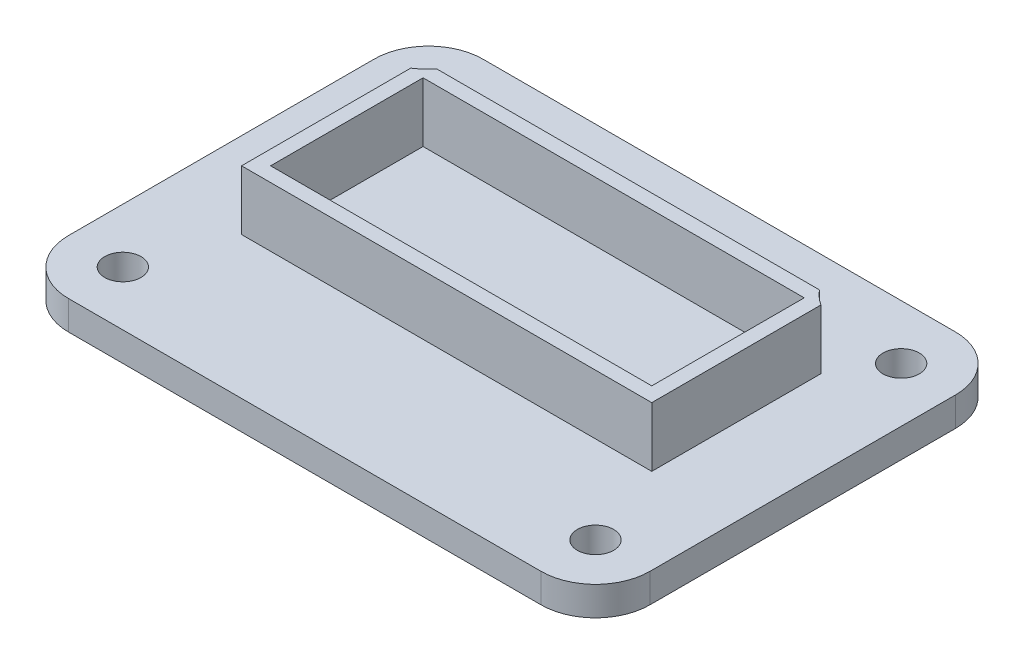
ISO-10303-21;
HEADER;
FILE_DESCRIPTION(('STEP AP214'),'2;1');
FILE_NAME('part.step','',(''),(''),'','','');
FILE_SCHEMA(('AUTOMOTIVE_DESIGN { 1 0 10303 214 1 1 1 1 }'));
ENDSEC;
DATA;
#1=APPLICATION_CONTEXT('core data for automotive mechanical design processes');
#2=APPLICATION_PROTOCOL_DEFINITION('international standard','automotive_design',2000,#1);
#3=PRODUCT_CONTEXT('',#1,'mechanical');
#4=PRODUCT('Part','Part','',(#3));
#5=PRODUCT_RELATED_PRODUCT_CATEGORY('part','',(#4));
#6=PRODUCT_DEFINITION_FORMATION('','',#4);
#7=PRODUCT_DEFINITION_CONTEXT('part definition',#1,'design');
#8=PRODUCT_DEFINITION('design','',#6,#7);
#9=PRODUCT_DEFINITION_SHAPE('','',#8);
#10=(LENGTH_UNIT() NAMED_UNIT(*) SI_UNIT(.MILLI.,.METRE.));
#11=(NAMED_UNIT(*) PLANE_ANGLE_UNIT() SI_UNIT($,.RADIAN.));
#12=(NAMED_UNIT(*) SI_UNIT($,.STERADIAN.) SOLID_ANGLE_UNIT());
#13=UNCERTAINTY_MEASURE_WITH_UNIT(LENGTH_MEASURE(1.E-05),#10,'distance_accuracy_value','');
#14=(GEOMETRIC_REPRESENTATION_CONTEXT(3) GLOBAL_UNCERTAINTY_ASSIGNED_CONTEXT((#13)) GLOBAL_UNIT_ASSIGNED_CONTEXT((#10,
#11,#12)) REPRESENTATION_CONTEXT('',''));
#15=CARTESIAN_POINT('',(0.,0.,0.));
#16=DIRECTION('',(0.,0.,1.));
#17=DIRECTION('',(1.,0.,0.));
#18=AXIS2_PLACEMENT_3D('',#15,#16,#17);
#19=CARTESIAN_POINT('',(-65.1,4.,-42.1));
#20=DIRECTION('',(0.,1.,0.));
#21=DIRECTION('',(0.,0.,1.));
#22=AXIS2_PLACEMENT_3D('',#19,#20,#21);
#23=PLANE('',#22);
#24=CARTESIAN_POINT('',(0.,4.,-42.1));
#25=DIRECTION('',(0.,1.,0.));
#26=DIRECTION('',(0.,0.,1.));
#27=AXIS2_PLACEMENT_3D('',#24,#25,#26);
#28=CIRCLE('',#27,8.00000000000001);
#29=CARTESIAN_POINT('',(-4.29999999999999,4.,-35.3538900097908));
#30=VERTEX_POINT('',#29);
#31=CARTESIAN_POINT('',(-6.20463536398395,4.,-37.05));
#32=VERTEX_POINT('',#31);
#33=EDGE_CURVE('E162',#30,#32,#28,.F.);
#34=ORIENTED_EDGE('',*,*,#33,.F.);
#35=DIRECTION('',(0.,0.,-1.));
#36=VECTOR('',#35,1.);
#37=CARTESIAN_POINT('',(-4.29999999999999,4.,-42.1));
#38=LINE('',#37,#36);
#39=CARTESIAN_POINT('',(-4.29999999999999,4.,-12.05));
#40=VERTEX_POINT('',#39);
#41=EDGE_CURVE('E225',#40,#30,#38,.T.);
#42=ORIENTED_EDGE('',*,*,#41,.F.);
#43=DIRECTION('',(-1.,0.,0.));
#44=VECTOR('',#43,1.);
#45=CARTESIAN_POINT('',(-65.1,4.,-12.05));
#46=LINE('',#45,#44);
#47=CARTESIAN_POINT('',(-60.8,4.,-12.05));
#48=VERTEX_POINT('',#47);
#49=EDGE_CURVE('E228',#40,#48,#46,.T.);
#50=ORIENTED_EDGE('',*,*,#49,.T.);
#51=DIRECTION('',(0.,0.,-1.));
#52=VECTOR('',#51,1.);
#53=CARTESIAN_POINT('',(-60.8,4.,-42.1));
#54=LINE('',#53,#52);
#55=CARTESIAN_POINT('',(-60.8,4.,-35.3538900097908));
#56=VERTEX_POINT('',#55);
#57=EDGE_CURVE('E230',#48,#56,#54,.T.);
#58=ORIENTED_EDGE('',*,*,#57,.T.);
#59=CARTESIAN_POINT('',(-65.1,4.,-42.1));
#60=DIRECTION('',(0.,1.,0.));
#61=DIRECTION('',(0.,0.,1.));
#62=AXIS2_PLACEMENT_3D('',#59,#60,#61);
#63=CIRCLE('',#62,8.);
#64=CARTESIAN_POINT('',(-58.8953646360161,4.,-37.05));
#65=VERTEX_POINT('',#64);
#66=EDGE_CURVE('E53',#56,#65,#63,.T.);
#67=ORIENTED_EDGE('',*,*,#66,.T.);
#68=DIRECTION('',(-1.,0.,0.));
#69=VECTOR('',#68,1.);
#70=CARTESIAN_POINT('',(-65.1,4.,-37.05));
#71=LINE('',#70,#69);
#72=EDGE_CURVE('E48',#32,#65,#71,.T.);
#73=ORIENTED_EDGE('',*,*,#72,.F.);
#74=EDGE_LOOP('',(#34,#42,#50,#58,#67,#73));
#75=FACE_BOUND('',#74,.T.);
#76=CARTESIAN_POINT('',(0.,4.,0.));
#77=DIRECTION('',(0.,1.,0.));
#78=DIRECTION('',(0.,0.,1.));
#79=AXIS2_PLACEMENT_3D('',#76,#77,#78);
#80=CIRCLE('',#79,2.49999999999999);
#81=CARTESIAN_POINT('',(0.,4.,2.49999999999999));
#82=VERTEX_POINT('',#81);
#83=EDGE_CURVE('E260',#82,#82,#80,.F.);
#84=ORIENTED_EDGE('',*,*,#83,.T.);
#85=EDGE_LOOP('',(#84));
#86=FACE_BOUND('',#85,.T.);
#87=CARTESIAN_POINT('',(-65.1,4.,-42.1));
#88=DIRECTION('',(0.,1.,0.));
#89=DIRECTION('',(0.,0.,1.));
#90=AXIS2_PLACEMENT_3D('',#87,#88,#89);
#91=CIRCLE('',#90,2.5);
#92=CARTESIAN_POINT('',(-65.1,4.,-39.6));
#93=VERTEX_POINT('',#92);
#94=EDGE_CURVE('E254',#93,#93,#91,.F.);
#95=ORIENTED_EDGE('',*,*,#94,.T.);
#96=EDGE_LOOP('',(#95));
#97=FACE_BOUND('',#96,.T.);
#98=CARTESIAN_POINT('',(-65.1,4.,-42.1));
#99=DIRECTION('',(0.,1.,0.));
#100=DIRECTION('',(0.,0.,1.));
#101=AXIS2_PLACEMENT_3D('',#98,#99,#100);
#102=CIRCLE('',#101,7.5);
#103=CARTESIAN_POINT('',(-65.1,4.,-49.6));
#104=VERTEX_POINT('',#103);
#105=CARTESIAN_POINT('',(-72.6,4.,-42.1));
#106=VERTEX_POINT('',#105);
#107=EDGE_CURVE('E267',#104,#106,#102,.T.);
#108=ORIENTED_EDGE('',*,*,#107,.T.);
#109=DIRECTION('',(0.,0.,1.));
#110=VECTOR('',#109,1.);
#111=CARTESIAN_POINT('',(-72.6,4.,-42.1));
#112=LINE('',#111,#110);
#113=CARTESIAN_POINT('',(-72.6,4.,0.));
#114=VERTEX_POINT('',#113);
#115=EDGE_CURVE('E270',#106,#114,#112,.T.);
#116=ORIENTED_EDGE('',*,*,#115,.T.);
#117=CARTESIAN_POINT('',(-65.1,4.,0.));
#118=DIRECTION('',(0.,-1.,0.));
#119=DIRECTION('',(0.,0.,-1.));
#120=AXIS2_PLACEMENT_3D('',#117,#118,#119);
#121=CIRCLE('',#120,7.5);
#122=CARTESIAN_POINT('',(-65.1,4.,7.5));
#123=VERTEX_POINT('',#122);
#124=EDGE_CURVE('E273',#123,#114,#121,.T.);
#125=ORIENTED_EDGE('',*,*,#124,.F.);
#126=DIRECTION('',(1.,0.,0.));
#127=VECTOR('',#126,1.);
#128=CARTESIAN_POINT('',(-65.1,4.,7.5));
#129=LINE('',#128,#127);
#130=CARTESIAN_POINT('',(0.,4.,7.5));
#131=VERTEX_POINT('',#130);
#132=EDGE_CURVE('E276',#123,#131,#129,.T.);
#133=ORIENTED_EDGE('',*,*,#132,.T.);
#134=CARTESIAN_POINT('',(0.,4.,0.));
#135=DIRECTION('',(0.,1.,0.));
#136=DIRECTION('',(0.,0.,1.));
#137=AXIS2_PLACEMENT_3D('',#134,#135,#136);
#138=CIRCLE('',#137,7.5);
#139=CARTESIAN_POINT('',(7.5,4.,0.));
#140=VERTEX_POINT('',#139);
#141=EDGE_CURVE('E278',#131,#140,#138,.T.);
#142=ORIENTED_EDGE('',*,*,#141,.T.);
#143=DIRECTION('',(0.,0.,1.));
#144=VECTOR('',#143,1.);
#145=CARTESIAN_POINT('',(7.50000000000001,4.,-42.1));
#146=LINE('',#145,#144);
#147=CARTESIAN_POINT('',(7.50000000000001,4.,-42.1));
#148=VERTEX_POINT('',#147);
#149=EDGE_CURVE('E280',#148,#140,#146,.T.);
#150=ORIENTED_EDGE('',*,*,#149,.F.);
#151=CARTESIAN_POINT('',(0.,4.,-42.1));
#152=DIRECTION('',(0.,-1.,0.));
#153=DIRECTION('',(0.,0.,-1.));
#154=AXIS2_PLACEMENT_3D('',#151,#152,#153);
#155=CIRCLE('',#154,7.5);
#156=CARTESIAN_POINT('',(0.,4.,-49.6));
#157=VERTEX_POINT('',#156);
#158=EDGE_CURVE('E283',#157,#148,#155,.T.);
#159=ORIENTED_EDGE('',*,*,#158,.F.);
#160=DIRECTION('',(1.,0.,0.));
#161=VECTOR('',#160,1.);
#162=CARTESIAN_POINT('',(-65.1,4.,-49.6));
#163=LINE('',#162,#161);
#164=EDGE_CURVE('E286',#104,#157,#163,.T.);
#165=ORIENTED_EDGE('',*,*,#164,.F.);
#166=EDGE_LOOP('',(#108,#116,#125,#133,#142,#150,#159,#165));
#167=FACE_BOUND('',#166,.T.);
#168=CARTESIAN_POINT('',(0.,4.,-42.1));
#169=DIRECTION('',(0.,1.,0.));
#170=DIRECTION('',(0.,0.,1.));
#171=AXIS2_PLACEMENT_3D('',#168,#169,#170);
#172=CIRCLE('',#171,2.49999999999999);
#173=CARTESIAN_POINT('',(0.,4.,-39.6));
#174=VERTEX_POINT('',#173);
#175=EDGE_CURVE('E257',#174,#174,#172,.T.);
#176=ORIENTED_EDGE('',*,*,#175,.F.);
#177=EDGE_LOOP('',(#176));
#178=FACE_BOUND('',#177,.T.);
#179=CARTESIAN_POINT('',(-65.1,4.,0.));
#180=DIRECTION('',(0.,1.,0.));
#181=DIRECTION('',(0.,0.,1.));
#182=AXIS2_PLACEMENT_3D('',#179,#180,#181);
#183=CIRCLE('',#182,2.49999999999999);
#184=CARTESIAN_POINT('',(-65.1,4.,2.49999999999999));
#185=VERTEX_POINT('',#184);
#186=EDGE_CURVE('E263',#185,#185,#183,.T.);
#187=ORIENTED_EDGE('',*,*,#186,.F.);
#188=EDGE_LOOP('',(#187));
#189=FACE_BOUND('',#188,.T.);
#190=ADVANCED_FACE('F33',(#75,#86,#97,#167,#178,#189),#23,.T.);
#191=CARTESIAN_POINT('',(-65.1,0.,-42.1));
#192=DIRECTION('',(0.,1.,0.));
#193=DIRECTION('',(0.,0.,1.));
#194=AXIS2_PLACEMENT_3D('',#191,#192,#193);
#195=PLANE('',#194);
#196=CARTESIAN_POINT('',(0.,0.,-42.1));
#197=DIRECTION('',(0.,-1.,0.));
#198=DIRECTION('',(0.,0.,-1.));
#199=AXIS2_PLACEMENT_3D('',#196,#197,#198);
#200=CIRCLE('',#199,2.49999999999999);
#201=CARTESIAN_POINT('',(0.,0.,-44.6));
#202=VERTEX_POINT('',#201);
#203=EDGE_CURVE('E243',#202,#202,#200,.T.);
#204=ORIENTED_EDGE('',*,*,#203,.F.);
#205=EDGE_LOOP('',(#204));
#206=FACE_BOUND('',#205,.T.);
#207=CARTESIAN_POINT('',(-65.1,0.,-42.1));
#208=DIRECTION('',(0.,1.,0.));
#209=DIRECTION('',(0.,0.,1.));
#210=AXIS2_PLACEMENT_3D('',#207,#208,#209);
#211=CIRCLE('',#210,2.5);
#212=CARTESIAN_POINT('',(-65.1,0.,-39.6));
#213=VERTEX_POINT('',#212);
#214=EDGE_CURVE('E246',#213,#213,#211,.T.);
#215=ORIENTED_EDGE('',*,*,#214,.T.);
#216=EDGE_LOOP('',(#215));
#217=FACE_BOUND('',#216,.T.);
#218=CARTESIAN_POINT('',(-65.1,0.,-42.1));
#219=DIRECTION('',(0.,1.,0.));
#220=DIRECTION('',(0.,0.,1.));
#221=AXIS2_PLACEMENT_3D('',#218,#219,#220);
#222=CIRCLE('',#221,7.5);
#223=CARTESIAN_POINT('',(-65.1,0.,-49.6));
#224=VERTEX_POINT('',#223);
#225=CARTESIAN_POINT('',(-72.6,0.,-42.1));
#226=VERTEX_POINT('',#225);
#227=EDGE_CURVE('E266',#224,#226,#222,.T.);
#228=ORIENTED_EDGE('',*,*,#227,.F.);
#229=DIRECTION('',(1.,0.,0.));
#230=VECTOR('',#229,1.);
#231=CARTESIAN_POINT('',(-65.1,0.,-49.6));
#232=LINE('',#231,#230);
#233=CARTESIAN_POINT('',(0.,0.,-49.6));
#234=VERTEX_POINT('',#233);
#235=EDGE_CURVE('E271',#224,#234,#232,.T.);
#236=ORIENTED_EDGE('',*,*,#235,.T.);
#237=CARTESIAN_POINT('',(0.,0.,-42.1));
#238=DIRECTION('',(0.,-1.,0.));
#239=DIRECTION('',(0.,0.,-1.));
#240=AXIS2_PLACEMENT_3D('',#237,#238,#239);
#241=CIRCLE('',#240,7.5);
#242=CARTESIAN_POINT('',(7.50000000000001,0.,-42.1));
#243=VERTEX_POINT('',#242);
#244=EDGE_CURVE('E306',#234,#243,#241,.T.);
#245=ORIENTED_EDGE('',*,*,#244,.T.);
#246=DIRECTION('',(0.,0.,1.));
#247=VECTOR('',#246,1.);
#248=CARTESIAN_POINT('',(7.50000000000001,0.,-42.1));
#249=LINE('',#248,#247);
#250=CARTESIAN_POINT('',(7.5,0.,0.));
#251=VERTEX_POINT('',#250);
#252=EDGE_CURVE('E303',#243,#251,#249,.T.);
#253=ORIENTED_EDGE('',*,*,#252,.T.);
#254=CARTESIAN_POINT('',(0.,0.,0.));
#255=DIRECTION('',(0.,1.,0.));
#256=DIRECTION('',(0.,0.,1.));
#257=AXIS2_PLACEMENT_3D('',#254,#255,#256);
#258=CIRCLE('',#257,7.5);
#259=CARTESIAN_POINT('',(0.,0.,7.5));
#260=VERTEX_POINT('',#259);
#261=EDGE_CURVE('E300',#260,#251,#258,.T.);
#262=ORIENTED_EDGE('',*,*,#261,.F.);
#263=DIRECTION('',(1.,0.,0.));
#264=VECTOR('',#263,1.);
#265=CARTESIAN_POINT('',(-65.1,0.,7.5));
#266=LINE('',#265,#264);
#267=CARTESIAN_POINT('',(-65.1,0.,7.5));
#268=VERTEX_POINT('',#267);
#269=EDGE_CURVE('E298',#268,#260,#266,.T.);
#270=ORIENTED_EDGE('',*,*,#269,.F.);
#271=CARTESIAN_POINT('',(-65.1,0.,0.));
#272=DIRECTION('',(0.,-1.,0.));
#273=DIRECTION('',(0.,0.,-1.));
#274=AXIS2_PLACEMENT_3D('',#271,#272,#273);
#275=CIRCLE('',#274,7.5);
#276=CARTESIAN_POINT('',(-72.6,0.,0.));
#277=VERTEX_POINT('',#276);
#278=EDGE_CURVE('E295',#268,#277,#275,.T.);
#279=ORIENTED_EDGE('',*,*,#278,.T.);
#280=DIRECTION('',(0.,0.,1.));
#281=VECTOR('',#280,1.);
#282=CARTESIAN_POINT('',(-72.6,0.,-42.1));
#283=LINE('',#282,#281);
#284=EDGE_CURVE('E292',#226,#277,#283,.T.);
#285=ORIENTED_EDGE('',*,*,#284,.F.);
#286=EDGE_LOOP('',(#228,#236,#245,#253,#262,#270,#279,#285));
#287=FACE_BOUND('',#286,.T.);
#288=CARTESIAN_POINT('',(0.,0.,0.));
#289=DIRECTION('',(0.,1.,0.));
#290=DIRECTION('',(0.,0.,1.));
#291=AXIS2_PLACEMENT_3D('',#288,#289,#290);
#292=CIRCLE('',#291,2.49999999999999);
#293=CARTESIAN_POINT('',(0.,0.,2.49999999999999));
#294=VERTEX_POINT('',#293);
#295=EDGE_CURVE('E247',#294,#294,#292,.T.);
#296=ORIENTED_EDGE('',*,*,#295,.T.);
#297=EDGE_LOOP('',(#296));
#298=FACE_BOUND('',#297,.T.);
#299=CARTESIAN_POINT('',(-65.1,0.,0.));
#300=DIRECTION('',(0.,-1.,0.));
#301=DIRECTION('',(0.,0.,-1.));
#302=AXIS2_PLACEMENT_3D('',#299,#300,#301);
#303=CIRCLE('',#302,2.49999999999999);
#304=CARTESIAN_POINT('',(-65.1,0.,-2.49999999999999));
#305=VERTEX_POINT('',#304);
#306=EDGE_CURVE('E242',#305,#305,#303,.T.);
#307=ORIENTED_EDGE('',*,*,#306,.F.);
#308=EDGE_LOOP('',(#307));
#309=FACE_BOUND('',#308,.T.);
#310=ADVANCED_FACE('F333',(#206,#217,#287,#298,#309),#195,.F.);
#311=CARTESIAN_POINT('',(-65.1,4.,-42.1));
#312=DIRECTION('',(0.,-1.,0.));
#313=DIRECTION('',(0.,0.,-1.));
#314=AXIS2_PLACEMENT_3D('',#311,#312,#313);
#315=CYLINDRICAL_SURFACE('',#314,7.5);
#316=ORIENTED_EDGE('',*,*,#227,.T.);
#317=DIRECTION('',(0.,-1.,0.));
#318=VECTOR('',#317,1.);
#319=CARTESIAN_POINT('',(-72.6,4.,-42.1));
#320=LINE('',#319,#318);
#321=EDGE_CURVE('E11',#106,#226,#320,.T.);
#322=ORIENTED_EDGE('',*,*,#321,.F.);
#323=ORIENTED_EDGE('',*,*,#107,.F.);
#324=DIRECTION('',(0.,-1.,0.));
#325=VECTOR('',#324,1.);
#326=CARTESIAN_POINT('',(-65.1,4.,-49.6));
#327=LINE('',#326,#325);
#328=EDGE_CURVE('E289',#104,#224,#327,.T.);
#329=ORIENTED_EDGE('',*,*,#328,.T.);
#330=EDGE_LOOP('',(#316,#322,#323,#329));
#331=FACE_BOUND('',#330,.T.);
#332=ADVANCED_FACE('F35',(#331),#315,.T.);
#333=CARTESIAN_POINT('',(-72.6,4.,-42.1));
#334=DIRECTION('',(1.,0.,0.));
#335=DIRECTION('',(0.,0.,-1.));
#336=AXIS2_PLACEMENT_3D('',#333,#334,#335);
#337=PLANE('',#336);
#338=ORIENTED_EDGE('',*,*,#284,.T.);
#339=DIRECTION('',(0.,-1.,0.));
#340=VECTOR('',#339,1.);
#341=CARTESIAN_POINT('',(-72.6,4.,0.));
#342=LINE('',#341,#340);
#343=EDGE_CURVE('E41',#114,#277,#342,.T.);
#344=ORIENTED_EDGE('',*,*,#343,.F.);
#345=ORIENTED_EDGE('',*,*,#115,.F.);
#346=ORIENTED_EDGE('',*,*,#321,.T.);
#347=EDGE_LOOP('',(#338,#344,#345,#346));
#348=FACE_BOUND('',#347,.T.);
#349=ADVANCED_FACE('F328',(#348),#337,.F.);
#350=CARTESIAN_POINT('',(-65.1,4.,0.));
#351=DIRECTION('',(0.,-1.,0.));
#352=DIRECTION('',(0.,0.,-1.));
#353=AXIS2_PLACEMENT_3D('',#350,#351,#352);
#354=CYLINDRICAL_SURFACE('',#353,7.5);
#355=ORIENTED_EDGE('',*,*,#278,.F.);
#356=DIRECTION('',(0.,-1.,0.));
#357=VECTOR('',#356,1.);
#358=CARTESIAN_POINT('',(-65.1,4.,7.5));
#359=LINE('',#358,#357);
#360=EDGE_CURVE('E321',#123,#268,#359,.T.);
#361=ORIENTED_EDGE('',*,*,#360,.F.);
#362=ORIENTED_EDGE('',*,*,#124,.T.);
#363=ORIENTED_EDGE('',*,*,#343,.T.);
#364=EDGE_LOOP('',(#355,#361,#362,#363));
#365=FACE_BOUND('',#364,.T.);
#366=ADVANCED_FACE('F325',(#365),#354,.T.);
#367=CARTESIAN_POINT('',(-65.1,4.,7.5));
#368=DIRECTION('',(0.,0.,-1.));
#369=DIRECTION('',(-1.,0.,0.));
#370=AXIS2_PLACEMENT_3D('',#367,#368,#369);
#371=PLANE('',#370);
#372=ORIENTED_EDGE('',*,*,#269,.T.);
#373=DIRECTION('',(0.,-1.,0.));
#374=VECTOR('',#373,1.);
#375=CARTESIAN_POINT('',(0.,4.,7.5));
#376=LINE('',#375,#374);
#377=EDGE_CURVE('E318',#131,#260,#376,.T.);
#378=ORIENTED_EDGE('',*,*,#377,.F.);
#379=ORIENTED_EDGE('',*,*,#132,.F.);
#380=ORIENTED_EDGE('',*,*,#360,.T.);
#381=EDGE_LOOP('',(#372,#378,#379,#380));
#382=FACE_BOUND('',#381,.T.);
#383=ADVANCED_FACE('F338',(#382),#371,.F.);
#384=CARTESIAN_POINT('',(0.,4.,0.));
#385=DIRECTION('',(0.,-1.,0.));
#386=DIRECTION('',(0.,0.,-1.));
#387=AXIS2_PLACEMENT_3D('',#384,#385,#386);
#388=CYLINDRICAL_SURFACE('',#387,7.5);
#389=ORIENTED_EDGE('',*,*,#261,.T.);
#390=DIRECTION('',(0.,-1.,0.));
#391=VECTOR('',#390,1.);
#392=CARTESIAN_POINT('',(7.5,4.,0.));
#393=LINE('',#392,#391);
#394=EDGE_CURVE('E316',#140,#251,#393,.T.);
#395=ORIENTED_EDGE('',*,*,#394,.F.);
#396=ORIENTED_EDGE('',*,*,#141,.F.);
#397=ORIENTED_EDGE('',*,*,#377,.T.);
#398=EDGE_LOOP('',(#389,#395,#396,#397));
#399=FACE_BOUND('',#398,.T.);
#400=ADVANCED_FACE('F342',(#399),#388,.T.);
#401=CARTESIAN_POINT('',(7.50000000000001,4.,-42.1));
#402=DIRECTION('',(1.,0.,0.));
#403=DIRECTION('',(0.,0.,-1.));
#404=AXIS2_PLACEMENT_3D('',#401,#402,#403);
#405=PLANE('',#404);
#406=ORIENTED_EDGE('',*,*,#252,.F.);
#407=DIRECTION('',(0.,-1.,0.));
#408=VECTOR('',#407,1.);
#409=CARTESIAN_POINT('',(7.50000000000001,4.,-42.1));
#410=LINE('',#409,#408);
#411=EDGE_CURVE('E314',#148,#243,#410,.T.);
#412=ORIENTED_EDGE('',*,*,#411,.F.);
#413=ORIENTED_EDGE('',*,*,#149,.T.);
#414=ORIENTED_EDGE('',*,*,#394,.T.);
#415=EDGE_LOOP('',(#406,#412,#413,#414));
#416=FACE_BOUND('',#415,.T.);
#417=ADVANCED_FACE('F359',(#416),#405,.T.);
#418=CARTESIAN_POINT('',(0.,4.,-42.1));
#419=DIRECTION('',(0.,-1.,0.));
#420=DIRECTION('',(0.,0.,-1.));
#421=AXIS2_PLACEMENT_3D('',#418,#419,#420);
#422=CYLINDRICAL_SURFACE('',#421,7.5);
#423=ORIENTED_EDGE('',*,*,#244,.F.);
#424=DIRECTION('',(0.,-1.,0.));
#425=VECTOR('',#424,1.);
#426=CARTESIAN_POINT('',(0.,4.,-49.6));
#427=LINE('',#426,#425);
#428=EDGE_CURVE('E312',#157,#234,#427,.T.);
#429=ORIENTED_EDGE('',*,*,#428,.F.);
#430=ORIENTED_EDGE('',*,*,#158,.T.);
#431=ORIENTED_EDGE('',*,*,#411,.T.);
#432=EDGE_LOOP('',(#423,#429,#430,#431));
#433=FACE_BOUND('',#432,.T.);
#434=ADVANCED_FACE('F356',(#433),#422,.T.);
#435=CARTESIAN_POINT('',(-65.1,4.,-49.6));
#436=DIRECTION('',(0.,0.,-1.));
#437=DIRECTION('',(-1.,0.,0.));
#438=AXIS2_PLACEMENT_3D('',#435,#436,#437);
#439=PLANE('',#438);
#440=ORIENTED_EDGE('',*,*,#235,.F.);
#441=ORIENTED_EDGE('',*,*,#328,.F.);
#442=ORIENTED_EDGE('',*,*,#164,.T.);
#443=ORIENTED_EDGE('',*,*,#428,.T.);
#444=EDGE_LOOP('',(#440,#441,#442,#443));
#445=FACE_BOUND('',#444,.T.);
#446=ADVANCED_FACE('F353',(#445),#439,.T.);
#447=CARTESIAN_POINT('',(-65.1,5.,-42.1));
#448=DIRECTION('',(0.,-1.,0.));
#449=DIRECTION('',(0.,0.,-1.));
#450=AXIS2_PLACEMENT_3D('',#447,#448,#449);
#451=CYLINDRICAL_SURFACE('',#450,2.5);
#452=ORIENTED_EDGE('',*,*,#94,.F.);
#453=EDGE_LOOP('',(#452));
#454=FACE_BOUND('',#453,.T.);
#455=ORIENTED_EDGE('',*,*,#214,.F.);
#456=EDGE_LOOP('',(#455));
#457=FACE_BOUND('',#456,.T.);
#458=ADVANCED_FACE('F434',(#454,#457),#451,.F.);
#459=CARTESIAN_POINT('',(0.,5.,-42.1));
#460=DIRECTION('',(0.,-1.,0.));
#461=DIRECTION('',(0.,0.,-1.));
#462=AXIS2_PLACEMENT_3D('',#459,#460,#461);
#463=CYLINDRICAL_SURFACE('',#462,2.49999999999999);
#464=ORIENTED_EDGE('',*,*,#175,.T.);
#465=EDGE_LOOP('',(#464));
#466=FACE_BOUND('',#465,.T.);
#467=ORIENTED_EDGE('',*,*,#203,.T.);
#468=EDGE_LOOP('',(#467));
#469=FACE_BOUND('',#468,.T.);
#470=ADVANCED_FACE('F430',(#466,#469),#463,.F.);
#471=CARTESIAN_POINT('',(0.,5.,0.));
#472=DIRECTION('',(0.,-1.,0.));
#473=DIRECTION('',(0.,0.,-1.));
#474=AXIS2_PLACEMENT_3D('',#471,#472,#473);
#475=CYLINDRICAL_SURFACE('',#474,2.49999999999999);
#476=ORIENTED_EDGE('',*,*,#83,.F.);
#477=EDGE_LOOP('',(#476));
#478=FACE_BOUND('',#477,.T.);
#479=ORIENTED_EDGE('',*,*,#295,.F.);
#480=EDGE_LOOP('',(#479));
#481=FACE_BOUND('',#480,.T.);
#482=ADVANCED_FACE('F433',(#478,#481),#475,.F.);
#483=CARTESIAN_POINT('',(-65.1,5.,0.));
#484=DIRECTION('',(0.,-1.,0.));
#485=DIRECTION('',(0.,0.,-1.));
#486=AXIS2_PLACEMENT_3D('',#483,#484,#485);
#487=CYLINDRICAL_SURFACE('',#486,2.49999999999999);
#488=ORIENTED_EDGE('',*,*,#186,.T.);
#489=EDGE_LOOP('',(#488));
#490=FACE_BOUND('',#489,.T.);
#491=ORIENTED_EDGE('',*,*,#306,.T.);
#492=EDGE_LOOP('',(#491));
#493=FACE_BOUND('',#492,.T.);
#494=ADVANCED_FACE('F411',(#490,#493),#487,.F.);
#495=CARTESIAN_POINT('',(0.,12.2,-35.05));
#496=DIRECTION('',(0.,0.,-1.));
#497=DIRECTION('',(-1.,0.,0.));
#498=AXIS2_PLACEMENT_3D('',#495,#496,#497);
#499=PLANE('',#498);
#500=DIRECTION('',(-1.,0.,0.));
#501=VECTOR('',#500,1.);
#502=CARTESIAN_POINT('',(-65.1,4.,-35.05));
#503=LINE('',#502,#501);
#504=CARTESIAN_POINT('',(-6.3,4.,-35.05));
#505=VERTEX_POINT('',#504);
#506=CARTESIAN_POINT('',(-58.8,4.,-35.05));
#507=VERTEX_POINT('',#506);
#508=EDGE_CURVE('E240',#505,#507,#503,.T.);
#509=ORIENTED_EDGE('',*,*,#508,.F.);
#510=DIRECTION('',(0.,-1.,0.));
#511=VECTOR('',#510,1.);
#512=CARTESIAN_POINT('',(-6.3,12.2,-35.05));
#513=LINE('',#512,#511);
#514=CARTESIAN_POINT('',(-6.3,12.2,-35.05));
#515=VERTEX_POINT('',#514);
#516=EDGE_CURVE('E208',#515,#505,#513,.T.);
#517=ORIENTED_EDGE('',*,*,#516,.F.);
#518=DIRECTION('',(1.,0.,0.));
#519=VECTOR('',#518,1.);
#520=CARTESIAN_POINT('',(0.,12.2,-35.05));
#521=LINE('',#520,#519);
#522=CARTESIAN_POINT('',(-58.8,12.2,-35.05));
#523=VERTEX_POINT('',#522);
#524=EDGE_CURVE('E188',#523,#515,#521,.T.);
#525=ORIENTED_EDGE('',*,*,#524,.F.);
#526=DIRECTION('',(0.,-1.,0.));
#527=VECTOR('',#526,1.);
#528=CARTESIAN_POINT('',(-58.8,12.2,-35.05));
#529=LINE('',#528,#527);
#530=EDGE_CURVE('E165',#523,#507,#529,.T.);
#531=ORIENTED_EDGE('',*,*,#530,.T.);
#532=EDGE_LOOP('',(#509,#517,#525,#531));
#533=FACE_BOUND('',#532,.T.);
#534=ADVANCED_FACE('F391',(#533),#499,.F.);
#535=CARTESIAN_POINT('',(-6.29999999999999,12.2,0.));
#536=DIRECTION('',(1.,0.,0.));
#537=DIRECTION('',(0.,0.,-1.));
#538=AXIS2_PLACEMENT_3D('',#535,#536,#537);
#539=PLANE('',#538);
#540=DIRECTION('',(0.,0.,-1.));
#541=VECTOR('',#540,1.);
#542=CARTESIAN_POINT('',(-6.3,4.,-42.1));
#543=LINE('',#542,#541);
#544=CARTESIAN_POINT('',(-6.29999999999999,4.,-14.05));
#545=VERTEX_POINT('',#544);
#546=EDGE_CURVE('E238',#545,#505,#543,.T.);
#547=ORIENTED_EDGE('',*,*,#546,.F.);
#548=DIRECTION('',(0.,-1.,0.));
#549=VECTOR('',#548,1.);
#550=CARTESIAN_POINT('',(-6.29999999999999,12.2,-14.05));
#551=LINE('',#550,#549);
#552=CARTESIAN_POINT('',(-6.29999999999999,12.2,-14.05));
#553=VERTEX_POINT('',#552);
#554=EDGE_CURVE('E205',#553,#545,#551,.T.);
#555=ORIENTED_EDGE('',*,*,#554,.F.);
#556=DIRECTION('',(0.,0.,1.));
#557=VECTOR('',#556,1.);
#558=CARTESIAN_POINT('',(-6.29999999999999,12.2,0.));
#559=LINE('',#558,#557);
#560=EDGE_CURVE('E191',#515,#553,#559,.T.);
#561=ORIENTED_EDGE('',*,*,#560,.F.);
#562=ORIENTED_EDGE('',*,*,#516,.T.);
#563=EDGE_LOOP('',(#547,#555,#561,#562));
#564=FACE_BOUND('',#563,.T.);
#565=ADVANCED_FACE('F393',(#564),#539,.F.);
#566=CARTESIAN_POINT('',(0.,12.2,-14.05));
#567=DIRECTION('',(0.,0.,-1.));
#568=DIRECTION('',(-1.,0.,0.));
#569=AXIS2_PLACEMENT_3D('',#566,#567,#568);
#570=PLANE('',#569);
#571=ORIENTED_EDGE('',*,*,#554,.T.);
#572=DIRECTION('',(-1.,0.,0.));
#573=VECTOR('',#572,1.);
#574=CARTESIAN_POINT('',(-65.1,4.,-14.05));
#575=LINE('',#574,#573);
#576=CARTESIAN_POINT('',(-58.8,4.,-14.05));
#577=VERTEX_POINT('',#576);
#578=EDGE_CURVE('E235',#545,#577,#575,.T.);
#579=ORIENTED_EDGE('',*,*,#578,.T.);
#580=DIRECTION('',(0.,-1.,0.));
#581=VECTOR('',#580,1.);
#582=CARTESIAN_POINT('',(-58.8,12.2,-14.05));
#583=LINE('',#582,#581);
#584=CARTESIAN_POINT('',(-58.8,12.2,-14.05));
#585=VERTEX_POINT('',#584);
#586=EDGE_CURVE('E202',#585,#577,#583,.T.);
#587=ORIENTED_EDGE('',*,*,#586,.F.);
#588=DIRECTION('',(1.,0.,0.));
#589=VECTOR('',#588,1.);
#590=CARTESIAN_POINT('',(0.,12.2,-14.05));
#591=LINE('',#590,#589);
#592=EDGE_CURVE('E193',#585,#553,#591,.T.);
#593=ORIENTED_EDGE('',*,*,#592,.T.);
#594=EDGE_LOOP('',(#571,#579,#587,#593));
#595=FACE_BOUND('',#594,.T.);
#596=ADVANCED_FACE('F398',(#595),#570,.T.);
#597=CARTESIAN_POINT('',(0.,12.2,-42.1));
#598=DIRECTION('',(0.,-1.,0.));
#599=DIRECTION('',(0.,0.,-1.));
#600=AXIS2_PLACEMENT_3D('',#597,#598,#599);
#601=CYLINDRICAL_SURFACE('',#600,8.00000000000001);
#602=DIRECTION('',(0.,-1.,0.));
#603=VECTOR('',#602,1.);
#604=CARTESIAN_POINT('',(-4.29999999999999,12.2,-35.3538900097908));
#605=LINE('',#604,#603);
#606=CARTESIAN_POINT('',(-4.29999999999999,12.2,-35.3538900097908));
#607=VERTEX_POINT('',#606);
#608=EDGE_CURVE('E199',#607,#30,#605,.T.);
#609=ORIENTED_EDGE('',*,*,#608,.T.);
#610=ORIENTED_EDGE('',*,*,#33,.T.);
#611=DIRECTION('',(0.,-1.,0.));
#612=VECTOR('',#611,1.);
#613=CARTESIAN_POINT('',(-6.20463536398395,12.2,-37.05));
#614=LINE('',#613,#612);
#615=CARTESIAN_POINT('',(-6.20463536398395,12.2,-37.05));
#616=VERTEX_POINT('',#615);
#617=EDGE_CURVE('E156',#616,#32,#614,.T.);
#618=ORIENTED_EDGE('',*,*,#617,.F.);
#619=CARTESIAN_POINT('',(0.,12.2,-42.1));
#620=DIRECTION('',(0.,1.,0.));
#621=DIRECTION('',(0.,0.,1.));
#622=AXIS2_PLACEMENT_3D('',#619,#620,#621);
#623=CIRCLE('',#622,8.00000000000001);
#624=EDGE_CURVE('E160',#616,#607,#623,.T.);
#625=ORIENTED_EDGE('',*,*,#624,.T.);
#626=EDGE_LOOP('',(#609,#610,#618,#625));
#627=FACE_BOUND('',#626,.T.);
#628=ADVANCED_FACE('F159',(#627),#601,.F.);
#629=CARTESIAN_POINT('',(0.,12.2,-37.05));
#630=DIRECTION('',(0.,0.,-1.));
#631=DIRECTION('',(-1.,0.,0.));
#632=AXIS2_PLACEMENT_3D('',#629,#630,#631);
#633=PLANE('',#632);
#634=ORIENTED_EDGE('',*,*,#617,.T.);
#635=ORIENTED_EDGE('',*,*,#72,.T.);
#636=DIRECTION('',(0.,-1.,0.));
#637=VECTOR('',#636,1.);
#638=CARTESIAN_POINT('',(-58.8953646360161,12.2,-37.05));
#639=LINE('',#638,#637);
#640=CARTESIAN_POINT('',(-58.8953646360161,12.2,-37.05));
#641=VERTEX_POINT('',#640);
#642=EDGE_CURVE('E166',#641,#65,#639,.T.);
#643=ORIENTED_EDGE('',*,*,#642,.F.);
#644=DIRECTION('',(1.,0.,0.));
#645=VECTOR('',#644,1.);
#646=CARTESIAN_POINT('',(0.,12.2,-37.05));
#647=LINE('',#646,#645);
#648=EDGE_CURVE('E172',#641,#616,#647,.T.);
#649=ORIENTED_EDGE('',*,*,#648,.T.);
#650=EDGE_LOOP('',(#634,#635,#643,#649));
#651=FACE_BOUND('',#650,.T.);
#652=ADVANCED_FACE('F176',(#651),#633,.T.);
#653=CARTESIAN_POINT('',(-65.1,12.2,-42.1));
#654=DIRECTION('',(0.,-1.,0.));
#655=DIRECTION('',(0.,0.,-1.));
#656=AXIS2_PLACEMENT_3D('',#653,#654,#655);
#657=CYLINDRICAL_SURFACE('',#656,8.);
#658=ORIENTED_EDGE('',*,*,#66,.F.);
#659=DIRECTION('',(0.,-1.,0.));
#660=VECTOR('',#659,1.);
#661=CARTESIAN_POINT('',(-60.8,12.2,-35.3538900097908));
#662=LINE('',#661,#660);
#663=CARTESIAN_POINT('',(-60.8,12.2,-35.3538900097908));
#664=VERTEX_POINT('',#663);
#665=EDGE_CURVE('E219',#664,#56,#662,.T.);
#666=ORIENTED_EDGE('',*,*,#665,.F.);
#667=CARTESIAN_POINT('',(-65.1,12.2,-42.1));
#668=DIRECTION('',(0.,1.,0.));
#669=DIRECTION('',(0.,0.,1.));
#670=AXIS2_PLACEMENT_3D('',#667,#668,#669);
#671=CIRCLE('',#670,8.);
#672=EDGE_CURVE('E179',#641,#664,#671,.F.);
#673=ORIENTED_EDGE('',*,*,#672,.F.);
#674=ORIENTED_EDGE('',*,*,#642,.T.);
#675=EDGE_LOOP('',(#658,#666,#673,#674));
#676=FACE_BOUND('',#675,.T.);
#677=ADVANCED_FACE('F423',(#676),#657,.F.);
#678=CARTESIAN_POINT('',(-60.8,12.2,0.));
#679=DIRECTION('',(1.,0.,0.));
#680=DIRECTION('',(0.,0.,-1.));
#681=AXIS2_PLACEMENT_3D('',#678,#679,#680);
#682=PLANE('',#681);
#683=ORIENTED_EDGE('',*,*,#57,.F.);
#684=DIRECTION('',(0.,-1.,0.));
#685=VECTOR('',#684,1.);
#686=CARTESIAN_POINT('',(-60.8,12.2,-12.05));
#687=LINE('',#686,#685);
#688=CARTESIAN_POINT('',(-60.8,12.2,-12.05));
#689=VERTEX_POINT('',#688);
#690=EDGE_CURVE('E216',#689,#48,#687,.T.);
#691=ORIENTED_EDGE('',*,*,#690,.F.);
#692=DIRECTION('',(0.,0.,1.));
#693=VECTOR('',#692,1.);
#694=CARTESIAN_POINT('',(-60.8,12.2,0.));
#695=LINE('',#694,#693);
#696=EDGE_CURVE('E181',#664,#689,#695,.T.);
#697=ORIENTED_EDGE('',*,*,#696,.F.);
#698=ORIENTED_EDGE('',*,*,#665,.T.);
#699=EDGE_LOOP('',(#683,#691,#697,#698));
#700=FACE_BOUND('',#699,.T.);
#701=ADVANCED_FACE('F419',(#700),#682,.F.);
#702=CARTESIAN_POINT('',(0.,12.2,-12.05));
#703=DIRECTION('',(0.,0.,-1.));
#704=DIRECTION('',(-1.,0.,0.));
#705=AXIS2_PLACEMENT_3D('',#702,#703,#704);
#706=PLANE('',#705);
#707=ORIENTED_EDGE('',*,*,#49,.F.);
#708=DIRECTION('',(0.,-1.,0.));
#709=VECTOR('',#708,1.);
#710=CARTESIAN_POINT('',(-4.29999999999999,12.2,-12.05));
#711=LINE('',#710,#709);
#712=CARTESIAN_POINT('',(-4.29999999999999,12.2,-12.05));
#713=VERTEX_POINT('',#712);
#714=EDGE_CURVE('E213',#713,#40,#711,.T.);
#715=ORIENTED_EDGE('',*,*,#714,.F.);
#716=DIRECTION('',(1.,0.,0.));
#717=VECTOR('',#716,1.);
#718=CARTESIAN_POINT('',(0.,12.2,-12.05));
#719=LINE('',#718,#717);
#720=EDGE_CURVE('E185',#689,#713,#719,.T.);
#721=ORIENTED_EDGE('',*,*,#720,.F.);
#722=ORIENTED_EDGE('',*,*,#690,.T.);
#723=EDGE_LOOP('',(#707,#715,#721,#722));
#724=FACE_BOUND('',#723,.T.);
#725=ADVANCED_FACE('F415',(#724),#706,.F.);
#726=CARTESIAN_POINT('',(-4.29999999999999,12.2,0.));
#727=DIRECTION('',(1.,0.,0.));
#728=DIRECTION('',(0.,0.,-1.));
#729=AXIS2_PLACEMENT_3D('',#726,#727,#728);
#730=PLANE('',#729);
#731=ORIENTED_EDGE('',*,*,#714,.T.);
#732=ORIENTED_EDGE('',*,*,#41,.T.);
#733=ORIENTED_EDGE('',*,*,#608,.F.);
#734=DIRECTION('',(0.,0.,1.));
#735=VECTOR('',#734,1.);
#736=CARTESIAN_POINT('',(-4.29999999999999,12.2,0.));
#737=LINE('',#736,#735);
#738=EDGE_CURVE('E174',#607,#713,#737,.T.);
#739=ORIENTED_EDGE('',*,*,#738,.T.);
#740=EDGE_LOOP('',(#731,#732,#733,#739));
#741=FACE_BOUND('',#740,.T.);
#742=ADVANCED_FACE('F412',(#741),#730,.T.);
#743=CARTESIAN_POINT('',(-58.8,12.2,0.));
#744=DIRECTION('',(1.,0.,0.));
#745=DIRECTION('',(0.,0.,-1.));
#746=AXIS2_PLACEMENT_3D('',#743,#744,#745);
#747=PLANE('',#746);
#748=ORIENTED_EDGE('',*,*,#586,.T.);
#749=DIRECTION('',(0.,0.,-1.));
#750=VECTOR('',#749,1.);
#751=CARTESIAN_POINT('',(-58.8,4.,-42.1));
#752=LINE('',#751,#750);
#753=EDGE_CURVE('E211',#577,#507,#752,.T.);
#754=ORIENTED_EDGE('',*,*,#753,.T.);
#755=ORIENTED_EDGE('',*,*,#530,.F.);
#756=DIRECTION('',(0.,0.,1.));
#757=VECTOR('',#756,1.);
#758=CARTESIAN_POINT('',(-58.8,12.2,0.));
#759=LINE('',#758,#757);
#760=EDGE_CURVE('E196',#523,#585,#759,.T.);
#761=ORIENTED_EDGE('',*,*,#760,.T.);
#762=EDGE_LOOP('',(#748,#754,#755,#761));
#763=FACE_BOUND('',#762,.T.);
#764=ADVANCED_FACE('F383',(#763),#747,.T.);
#765=CARTESIAN_POINT('',(0.,12.2,0.));
#766=DIRECTION('',(0.,1.,0.));
#767=DIRECTION('',(0.,0.,1.));
#768=AXIS2_PLACEMENT_3D('',#765,#766,#767);
#769=PLANE('',#768);
#770=ORIENTED_EDGE('',*,*,#624,.F.);
#771=ORIENTED_EDGE('',*,*,#648,.F.);
#772=ORIENTED_EDGE('',*,*,#672,.T.);
#773=ORIENTED_EDGE('',*,*,#696,.T.);
#774=ORIENTED_EDGE('',*,*,#720,.T.);
#775=ORIENTED_EDGE('',*,*,#738,.F.);
#776=EDGE_LOOP('',(#770,#771,#772,#773,#774,#775));
#777=FACE_BOUND('',#776,.T.);
#778=ORIENTED_EDGE('',*,*,#524,.T.);
#779=ORIENTED_EDGE('',*,*,#560,.T.);
#780=ORIENTED_EDGE('',*,*,#592,.F.);
#781=ORIENTED_EDGE('',*,*,#760,.F.);
#782=EDGE_LOOP('',(#778,#779,#780,#781));
#783=FACE_BOUND('',#782,.T.);
#784=ADVANCED_FACE('F170',(#777,#783),#769,.T.);
#785=ORIENTED_EDGE('',*,*,#546,.T.);
#786=ORIENTED_EDGE('',*,*,#508,.T.);
#787=ORIENTED_EDGE('',*,*,#753,.F.);
#788=ORIENTED_EDGE('',*,*,#578,.F.);
#789=EDGE_LOOP('',(#785,#786,#787,#788));
#790=FACE_BOUND('',#789,.T.);
#791=ADVANCED_FACE('F370',(#790),#23,.T.);
#792=CLOSED_SHELL('',(#190,#310,#332,#349,#366,#383,#400,#417,#434,#446,#458,#470,#482,#494,
#534,#565,#596,#628,#652,#677,#701,#725,#742,#764,#784,#791));
#793=MANIFOLD_SOLID_BREP('B2',#792);
#794=ADVANCED_BREP_SHAPE_REPRESENTATION('',(#18,#793),#14);
#795=SHAPE_DEFINITION_REPRESENTATION(#9,#794);
ENDSEC;
END-ISO-10303-21;
